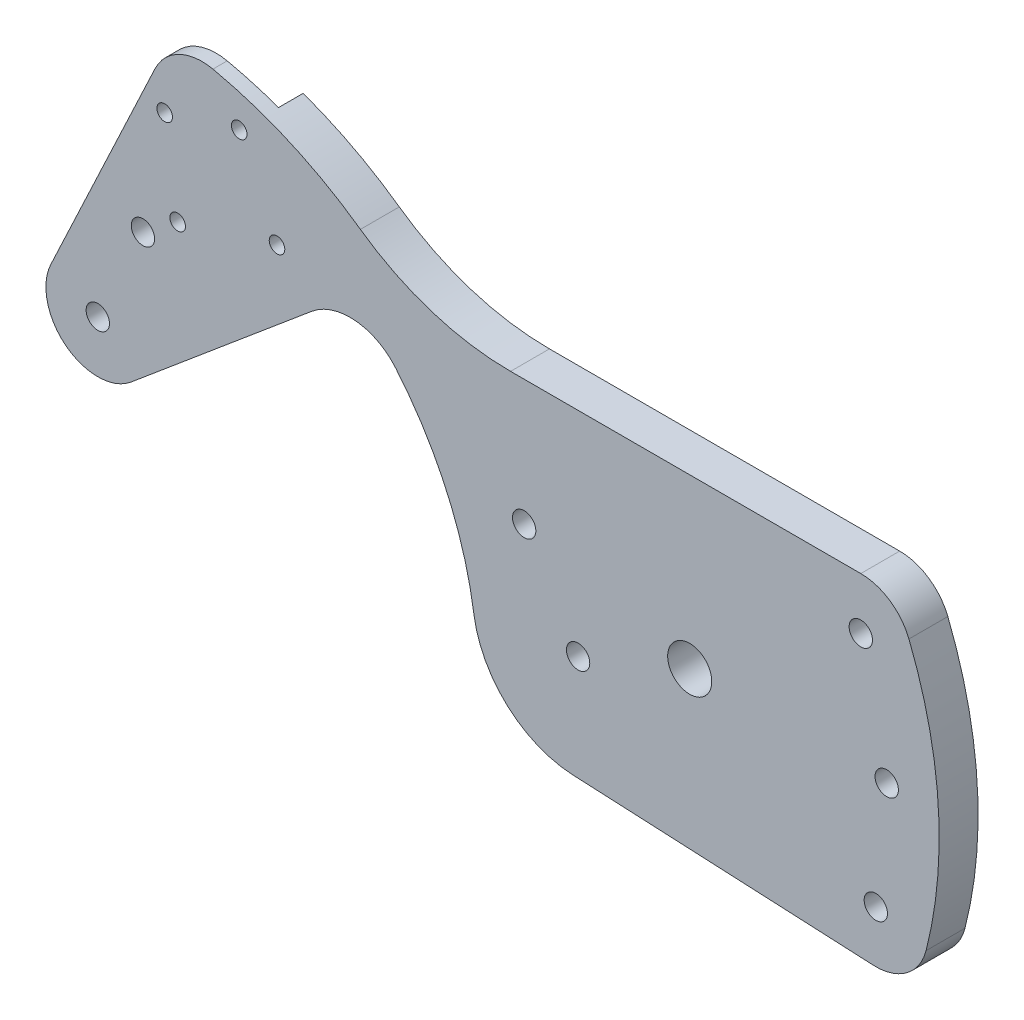
ISO-10303-21;
HEADER;
FILE_DESCRIPTION(('STEP AP214'),'2;1');
FILE_NAME('part.step','',(''),(''),'','','');
FILE_SCHEMA(('AUTOMOTIVE_DESIGN { 1 0 10303 214 1 1 1 1 }'));
ENDSEC;
DATA;
#1=APPLICATION_CONTEXT('core data for automotive mechanical design processes');
#2=APPLICATION_PROTOCOL_DEFINITION('international standard','automotive_design',2000,#1);
#3=PRODUCT_CONTEXT('',#1,'mechanical');
#4=PRODUCT('Part','Part','',(#3));
#5=PRODUCT_RELATED_PRODUCT_CATEGORY('part','',(#4));
#6=PRODUCT_DEFINITION_FORMATION('','',#4);
#7=PRODUCT_DEFINITION_CONTEXT('part definition',#1,'design');
#8=PRODUCT_DEFINITION('design','',#6,#7);
#9=PRODUCT_DEFINITION_SHAPE('','',#8);
#10=(LENGTH_UNIT() NAMED_UNIT(*) SI_UNIT(.MILLI.,.METRE.));
#11=(NAMED_UNIT(*) PLANE_ANGLE_UNIT() SI_UNIT($,.RADIAN.));
#12=(NAMED_UNIT(*) SI_UNIT($,.STERADIAN.) SOLID_ANGLE_UNIT());
#13=UNCERTAINTY_MEASURE_WITH_UNIT(LENGTH_MEASURE(1.E-05),#10,'distance_accuracy_value','');
#14=(GEOMETRIC_REPRESENTATION_CONTEXT(3) GLOBAL_UNCERTAINTY_ASSIGNED_CONTEXT((#13)) GLOBAL_UNIT_ASSIGNED_CONTEXT((#10,
#11,#12)) REPRESENTATION_CONTEXT('',''));
#15=CARTESIAN_POINT('',(0.,0.,0.));
#16=DIRECTION('',(0.,0.,1.));
#17=DIRECTION('',(1.,0.,0.));
#18=AXIS2_PLACEMENT_3D('',#15,#16,#17);
#19=CARTESIAN_POINT('',(-74.1892847970259,-68.5571228840362,7.5));
#20=DIRECTION('',(-0.95769511445002,-0.287784759427187,0.));
#21=DIRECTION('',(0.287784759427187,-0.95769511445002,0.));
#22=AXIS2_PLACEMENT_3D('',#19,#20,#21);
#23=PLANE('',#22);
#24=DIRECTION('',(-0.287784759427187,0.957695114450019,0.));
#25=VECTOR('',#24,1.);
#26=CARTESIAN_POINT('',(-95.9576660688243,3.88407391520334,2.75));
#27=LINE('',#26,#25);
#28=CARTESIAN_POINT('',(-95.9576660688243,3.88407391520334,2.75));
#29=VERTEX_POINT('',#28);
#30=CARTESIAN_POINT('',(-106.945535827358,40.4496974975837,2.75));
#31=VERTEX_POINT('',#30);
#32=EDGE_CURVE('E174',#29,#31,#27,.T.);
#33=ORIENTED_EDGE('',*,*,#32,.T.);
#34=DIRECTION('',(0.,0.,-1.));
#35=VECTOR('',#34,1.);
#36=CARTESIAN_POINT('',(-106.945535827358,40.4496974975837,0.75));
#37=LINE('',#36,#35);
#38=CARTESIAN_POINT('',(-106.945535827358,40.4496974975837,7.5));
#39=VERTEX_POINT('',#38);
#40=EDGE_CURVE('E364',#39,#31,#37,.T.);
#41=ORIENTED_EDGE('',*,*,#40,.F.);
#42=DIRECTION('',(-0.287784759427187,0.95769511445002,0.));
#43=VECTOR('',#42,1.);
#44=CARTESIAN_POINT('',(-74.1892847970259,-68.5571228840362,7.5));
#45=LINE('',#44,#43);
#46=CARTESIAN_POINT('',(-95.9576660688243,3.88407391520334,7.5));
#47=VERTEX_POINT('',#46);
#48=EDGE_CURVE('E11',#47,#39,#45,.T.);
#49=ORIENTED_EDGE('',*,*,#48,.F.);
#50=DIRECTION('',(0.,0.,-1.));
#51=VECTOR('',#50,1.);
#52=CARTESIAN_POINT('',(-95.9576660688243,3.88407391520334,0.75));
#53=LINE('',#52,#51);
#54=EDGE_CURVE('E168',#47,#29,#53,.T.);
#55=ORIENTED_EDGE('',*,*,#54,.T.);
#56=EDGE_LOOP('',(#33,#41,#49,#55));
#57=FACE_BOUND('',#56,.T.);
#58=ADVANCED_FACE('F38',(#57),#23,.F.);
#59=CARTESIAN_POINT('',(-48.3315167068753,-60.7869343795021,7.5));
#60=DIRECTION('',(0.95769511445002,0.287784759427187,0.));
#61=DIRECTION('',(-0.287784759427187,0.95769511445002,0.));
#62=AXIS2_PLACEMENT_3D('',#59,#60,#61);
#63=PLANE('',#62);
#64=DIRECTION('',(0.287784759427188,-0.95769511445002,0.));
#65=VECTOR('',#64,1.);
#66=CARTESIAN_POINT('',(-82.0220970357489,51.329163249051,2.75));
#67=LINE('',#66,#65);
#68=CARTESIAN_POINT('',(-82.0220970357489,51.329163249051,2.75));
#69=VERTEX_POINT('',#68);
#70=CARTESIAN_POINT('',(-73.4421904308482,22.7768012188099,2.75));
#71=VERTEX_POINT('',#70);
#72=EDGE_CURVE('E197',#69,#71,#67,.T.);
#73=ORIENTED_EDGE('',*,*,#72,.T.);
#74=DIRECTION('',(0.,0.,1.));
#75=VECTOR('',#74,1.);
#76=CARTESIAN_POINT('',(-73.4421904308482,22.7768012188099,0.75));
#77=LINE('',#76,#75);
#78=CARTESIAN_POINT('',(-73.4421904308482,22.7768012188099,7.5));
#79=VERTEX_POINT('',#78);
#80=EDGE_CURVE('E180',#71,#79,#77,.T.);
#81=ORIENTED_EDGE('',*,*,#80,.T.);
#82=DIRECTION('',(-0.287784759427187,0.95769511445002,0.));
#83=VECTOR('',#82,1.);
#84=CARTESIAN_POINT('',(-48.3315167068753,-60.7869343795021,7.5));
#85=LINE('',#84,#83);
#86=CARTESIAN_POINT('',(-82.0220970357489,51.3291632490509,7.5));
#87=VERTEX_POINT('',#86);
#88=EDGE_CURVE('E47',#79,#87,#85,.T.);
#89=ORIENTED_EDGE('',*,*,#88,.T.);
#90=DIRECTION('',(0.,0.,1.));
#91=VECTOR('',#90,1.);
#92=CARTESIAN_POINT('',(-82.0220970357489,51.3291632490509,0.75));
#93=LINE('',#92,#91);
#94=EDGE_CURVE('E181',#87,#69,#93,.F.);
#95=ORIENTED_EDGE('',*,*,#94,.T.);
#96=EDGE_LOOP('',(#73,#81,#89,#95));
#97=FACE_BOUND('',#96,.T.);
#98=ADVANCED_FACE('F40',(#97),#63,.F.);
#99=CARTESIAN_POINT('',(-41.5599291638824,49.5291948890183,0.75));
#100=DIRECTION('',(-0.642787609686535,0.766044443118982,0.));
#101=DIRECTION('',(-0.766044443118982,-0.642787609686535,0.));
#102=AXIS2_PLACEMENT_3D('',#99,#100,#101);
#103=PLANE('',#102);
#104=DIRECTION('',(0.766044443118982,0.642787609686534,0.));
#105=VECTOR('',#104,1.);
#106=CARTESIAN_POINT('',(-107.689906175498,-5.96044443118984,2.75));
#107=LINE('',#106,#105);
#108=CARTESIAN_POINT('',(-107.689906175498,-5.96044443118984,2.75));
#109=VERTEX_POINT('',#108);
#110=EDGE_CURVE('E165',#109,#29,#107,.T.);
#111=ORIENTED_EDGE('',*,*,#110,.T.);
#112=ORIENTED_EDGE('',*,*,#54,.F.);
#113=DIRECTION('',(0.766044443118982,0.642787609686534,0.));
#114=VECTOR('',#113,1.);
#115=CARTESIAN_POINT('',(-41.5599291638823,49.5291948890183,7.5));
#116=LINE('',#115,#114);
#117=EDGE_CURVE('E259',#47,#79,#116,.T.);
#118=ORIENTED_EDGE('',*,*,#117,.T.);
#119=ORIENTED_EDGE('',*,*,#80,.F.);
#120=DIRECTION('',(0.766044443118984,0.642787609686532,0.));
#121=VECTOR('',#120,1.);
#122=CARTESIAN_POINT('',(-73.4421904308482,22.7768012188099,2.75));
#123=LINE('',#122,#121);
#124=CARTESIAN_POINT('',(-72.8648183450266,23.2612739230748,2.75));
#125=VERTEX_POINT('',#124);
#126=EDGE_CURVE('E200',#71,#125,#123,.T.);
#127=ORIENTED_EDGE('',*,*,#126,.T.);
#128=DIRECTION('',(0.,0.,1.));
#129=VECTOR('',#128,1.);
#130=CARTESIAN_POINT('',(-72.8648183450266,23.2612739230748,0.75));
#131=LINE('',#130,#129);
#132=CARTESIAN_POINT('',(-72.8648183450266,23.2612739230748,10.25));
#133=VERTEX_POINT('',#132);
#134=EDGE_CURVE('E345',#125,#133,#131,.T.);
#135=ORIENTED_EDGE('',*,*,#134,.T.);
#136=DIRECTION('',(0.766044443118982,0.642787609686535,0.));
#137=VECTOR('',#136,1.);
#138=CARTESIAN_POINT('',(-41.5599291638824,49.5291948890183,10.25));
#139=LINE('',#138,#137);
#140=CARTESIAN_POINT('',(-107.689906175498,-5.96044443118984,10.25));
#141=VERTEX_POINT('',#140);
#142=EDGE_CURVE('E274',#141,#133,#139,.T.);
#143=ORIENTED_EDGE('',*,*,#142,.F.);
#144=DIRECTION('',(0.,0.,1.));
#145=VECTOR('',#144,1.);
#146=CARTESIAN_POINT('',(-107.689906175498,-5.96044443118984,0.75));
#147=LINE('',#146,#145);
#148=EDGE_CURVE('E172',#109,#141,#147,.T.);
#149=ORIENTED_EDGE('',*,*,#148,.F.);
#150=EDGE_LOOP('',(#111,#112,#118,#119,#127,#135,#143,#149));
#151=FACE_BOUND('',#150,.T.);
#152=ADVANCED_FACE('F167',(#151),#103,.F.);
#153=CARTESIAN_POINT('',(-34.5381520802066,82.4,0.75));
#154=DIRECTION('',(0.,0.,1.));
#155=DIRECTION('',(-1.,0.,0.));
#156=AXIS2_PLACEMENT_3D('',#153,#154,#155);
#157=CYLINDRICAL_SURFACE('',#156,50.);
#158=DIRECTION('',(0.,0.,1.));
#159=VECTOR('',#158,1.);
#160=CARTESIAN_POINT('',(-63.4870210289497,41.6328197370912,0.75));
#161=LINE('',#160,#159);
#162=CARTESIAN_POINT('',(-63.4870210289497,41.6328197370912,2.75));
#163=VERTEX_POINT('',#162);
#164=CARTESIAN_POINT('',(-63.4870210289497,41.6328197370912,10.25));
#165=VERTEX_POINT('',#164);
#166=EDGE_CURVE('E358',#163,#165,#161,.T.);
#167=ORIENTED_EDGE('',*,*,#166,.T.);
#168=CARTESIAN_POINT('',(-34.5381520802066,82.4,10.25));
#169=DIRECTION('',(0.,0.,1.));
#170=DIRECTION('',(1.,0.,0.));
#171=AXIS2_PLACEMENT_3D('',#168,#169,#170);
#172=CIRCLE('',#171,50.);
#173=CARTESIAN_POINT('',(-34.5381520802066,32.4,10.25));
#174=VERTEX_POINT('',#173);
#175=EDGE_CURVE('E261',#165,#174,#172,.T.);
#176=ORIENTED_EDGE('',*,*,#175,.T.);
#177=DIRECTION('',(0.,0.,1.));
#178=VECTOR('',#177,1.);
#179=CARTESIAN_POINT('',(-34.5381520802066,32.4,0.75));
#180=LINE('',#179,#178);
#181=CARTESIAN_POINT('',(-34.5381520802066,32.4,2.75));
#182=VERTEX_POINT('',#181);
#183=EDGE_CURVE('E321',#182,#174,#180,.T.);
#184=ORIENTED_EDGE('',*,*,#183,.F.);
#185=CARTESIAN_POINT('',(-34.5381520802066,82.4,2.75));
#186=DIRECTION('',(0.,0.,-1.));
#187=DIRECTION('',(1.,0.,0.));
#188=AXIS2_PLACEMENT_3D('',#185,#186,#187);
#189=CIRCLE('',#188,50.);
#190=EDGE_CURVE('E175',#182,#163,#189,.T.);
#191=ORIENTED_EDGE('',*,*,#190,.T.);
#192=EDGE_LOOP('',(#167,#176,#184,#191));
#193=FACE_BOUND('',#192,.T.);
#194=ADVANCED_FACE('F419',(#193),#157,.F.);
#195=CARTESIAN_POINT('',(-108.317782272363,-21.5,0.75));
#196=DIRECTION('',(0.,0.,1.));
#197=DIRECTION('',(-1.,0.,0.));
#198=AXIS2_PLACEMENT_3D('',#195,#196,#197);
#199=CYLINDRICAL_SURFACE('',#198,77.4309374967139);
#200=CARTESIAN_POINT('',(-108.317782272363,-21.5,2.75));
#201=DIRECTION('',(0.,0.,1.));
#202=DIRECTION('',(1.,0.,0.));
#203=AXIS2_PLACEMENT_3D('',#200,#201,#202);
#204=CIRCLE('',#203,77.430937496714);
#205=EDGE_CURVE('E194',#163,#69,#204,.T.);
#206=ORIENTED_EDGE('',*,*,#205,.T.);
#207=ORIENTED_EDGE('',*,*,#94,.F.);
#208=CARTESIAN_POINT('',(-108.317782272363,-21.5,7.5));
#209=DIRECTION('',(0.,0.,-1.));
#210=DIRECTION('',(-1.,0.,0.));
#211=AXIS2_PLACEMENT_3D('',#208,#209,#210);
#212=CIRCLE('',#211,77.4309374967139);
#213=CARTESIAN_POINT('',(-91.9187421242096,54.174444588905,7.5));
#214=VERTEX_POINT('',#213);
#215=EDGE_CURVE('E360',#214,#87,#212,.T.);
#216=ORIENTED_EDGE('',*,*,#215,.F.);
#217=DIRECTION('',(0.,0.,1.));
#218=VECTOR('',#217,1.);
#219=CARTESIAN_POINT('',(-91.9187421242096,54.174444588905,0.75));
#220=LINE('',#219,#218);
#221=CARTESIAN_POINT('',(-91.9187421242096,54.174444588905,10.25));
#222=VERTEX_POINT('',#221);
#223=EDGE_CURVE('E355',#214,#222,#220,.T.);
#224=ORIENTED_EDGE('',*,*,#223,.T.);
#225=CARTESIAN_POINT('',(-108.317782272363,-21.5,10.25));
#226=DIRECTION('',(0.,0.,1.));
#227=DIRECTION('',(1.,0.,0.));
#228=AXIS2_PLACEMENT_3D('',#225,#226,#227);
#229=CIRCLE('',#228,77.4309374967139);
#230=EDGE_CURVE('E264',#165,#222,#229,.T.);
#231=ORIENTED_EDGE('',*,*,#230,.F.);
#232=ORIENTED_EDGE('',*,*,#166,.F.);
#233=EDGE_LOOP('',(#206,#207,#216,#224,#231,#232));
#234=FACE_BOUND('',#233,.T.);
#235=ADVANCED_FACE('F395',(#234),#199,.T.);
#236=CARTESIAN_POINT('',(-103.154731418742,48.5106034239492,0.75));
#237=DIRECTION('',(-0.904929527308425,0.425561453382882,0.));
#238=DIRECTION('',(-0.425561453382882,-0.904929527308425,0.));
#239=AXIS2_PLACEMENT_3D('',#236,#237,#238);
#240=PLANE('',#239);
#241=DIRECTION('',(0.,0.,1.));
#242=VECTOR('',#241,1.);
#243=CARTESIAN_POINT('',(-123.167077545448,5.9556145338288,0.75));
#244=LINE('',#243,#242);
#245=CARTESIAN_POINT('',(-123.167077545448,5.9556145338288,2.75));
#246=VERTEX_POINT('',#245);
#247=CARTESIAN_POINT('',(-123.167077545448,5.9556145338288,10.25));
#248=VERTEX_POINT('',#247);
#249=EDGE_CURVE('E349',#246,#248,#244,.T.);
#250=ORIENTED_EDGE('',*,*,#249,.T.);
#251=DIRECTION('',(0.425561453382882,0.904929527308425,0.));
#252=VECTOR('',#251,1.);
#253=CARTESIAN_POINT('',(-103.154731418742,48.5106034239492,10.25));
#254=LINE('',#253,#252);
#255=CARTESIAN_POINT('',(-103.085929893281,48.6569055183213,10.25));
#256=VERTEX_POINT('',#255);
#257=EDGE_CURVE('E269',#248,#256,#254,.T.);
#258=ORIENTED_EDGE('',*,*,#257,.T.);
#259=DIRECTION('',(0.,0.,1.));
#260=VECTOR('',#259,1.);
#261=CARTESIAN_POINT('',(-103.085929893281,48.6569055183213,0.75));
#262=LINE('',#261,#260);
#263=CARTESIAN_POINT('',(-103.085929893281,48.6569055183213,7.5));
#264=VERTEX_POINT('',#263);
#265=EDGE_CURVE('E352',#264,#256,#262,.T.);
#266=ORIENTED_EDGE('',*,*,#265,.F.);
#267=DIRECTION('',(-0.425561453382882,-0.904929527308425,0.));
#268=VECTOR('',#267,1.);
#269=CARTESIAN_POINT('',(-103.154731418742,48.5106034239492,7.5));
#270=LINE('',#269,#268);
#271=EDGE_CURVE('E366',#264,#39,#270,.T.);
#272=ORIENTED_EDGE('',*,*,#271,.T.);
#273=ORIENTED_EDGE('',*,*,#40,.T.);
#274=DIRECTION('',(-0.425561453382882,-0.904929527308425,0.));
#275=VECTOR('',#274,1.);
#276=CARTESIAN_POINT('',(-106.945535827358,40.4496974975837,2.75));
#277=LINE('',#276,#275);
#278=EDGE_CURVE('E184',#31,#246,#277,.T.);
#279=ORIENTED_EDGE('',*,*,#278,.T.);
#280=EDGE_LOOP('',(#250,#258,#266,#272,#273,#279));
#281=FACE_BOUND('',#280,.T.);
#282=ADVANCED_FACE('F413',(#281),#240,.T.);
#283=CARTESIAN_POINT('',(-114.117782272363,1.69999999999999,0.75));
#284=DIRECTION('',(0.,0.,1.));
#285=DIRECTION('',(-1.,0.,0.));
#286=AXIS2_PLACEMENT_3D('',#283,#284,#285);
#287=CYLINDRICAL_SURFACE('',#286,9.99999999999999);
#288=CARTESIAN_POINT('',(-114.117782272363,1.69999999999999,2.75));
#289=DIRECTION('',(0.,0.,1.));
#290=DIRECTION('',(1.,0.,0.));
#291=AXIS2_PLACEMENT_3D('',#288,#289,#290);
#292=CIRCLE('',#291,10.);
#293=EDGE_CURVE('E55',#246,#109,#292,.T.);
#294=ORIENTED_EDGE('',*,*,#293,.T.);
#295=ORIENTED_EDGE('',*,*,#148,.T.);
#296=CARTESIAN_POINT('',(-114.117782272363,1.69999999999999,10.25));
#297=DIRECTION('',(0.,0.,1.));
#298=DIRECTION('',(1.,0.,0.));
#299=AXIS2_PLACEMENT_3D('',#296,#297,#298);
#300=CIRCLE('',#299,9.99999999999999);
#301=EDGE_CURVE('E272',#248,#141,#300,.T.);
#302=ORIENTED_EDGE('',*,*,#301,.F.);
#303=ORIENTED_EDGE('',*,*,#249,.F.);
#304=EDGE_LOOP('',(#294,#295,#302,#303));
#305=FACE_BOUND('',#304,.T.);
#306=ADVANCED_FACE('F411',(#305),#287,.T.);
#307=CARTESIAN_POINT('',(-65.4725042221845,14.4514570095927,0.75));
#308=DIRECTION('',(0.,0.,1.));
#309=DIRECTION('',(-1.,0.,0.));
#310=AXIS2_PLACEMENT_3D('',#307,#308,#309);
#311=CYLINDRICAL_SURFACE('',#310,11.5003992165423);
#312=DIRECTION('',(0.,0.,1.));
#313=VECTOR('',#312,1.);
#314=CARTESIAN_POINT('',(-56.6626873087024,21.8437711324349,0.75));
#315=LINE('',#314,#313);
#316=CARTESIAN_POINT('',(-56.6626873087024,21.8437711324349,2.75));
#317=VERTEX_POINT('',#316);
#318=CARTESIAN_POINT('',(-56.6626873087024,21.8437711324349,10.25));
#319=VERTEX_POINT('',#318);
#320=EDGE_CURVE('E342',#317,#319,#315,.T.);
#321=ORIENTED_EDGE('',*,*,#320,.T.);
#322=CARTESIAN_POINT('',(-65.4725042221845,14.4514570095927,10.25));
#323=DIRECTION('',(0.,0.,1.));
#324=DIRECTION('',(1.,0.,0.));
#325=AXIS2_PLACEMENT_3D('',#322,#323,#324);
#326=CIRCLE('',#325,11.5003992165423);
#327=EDGE_CURVE('E277',#319,#133,#326,.T.);
#328=ORIENTED_EDGE('',*,*,#327,.T.);
#329=ORIENTED_EDGE('',*,*,#134,.F.);
#330=CARTESIAN_POINT('',(-65.4725042221845,14.4514570095927,2.75));
#331=DIRECTION('',(0.,0.,-1.));
#332=DIRECTION('',(1.,0.,0.));
#333=AXIS2_PLACEMENT_3D('',#330,#331,#332);
#334=CIRCLE('',#333,11.5003992165423);
#335=EDGE_CURVE('E203',#125,#317,#334,.T.);
#336=ORIENTED_EDGE('',*,*,#335,.T.);
#337=EDGE_LOOP('',(#321,#328,#329,#336));
#338=FACE_BOUND('',#337,.T.);
#339=ADVANCED_FACE('F401',(#338),#311,.F.);
#340=CARTESIAN_POINT('',(-108.317782272363,-21.5,0.75));
#341=DIRECTION('',(0.,0.,1.));
#342=DIRECTION('',(-1.,0.,0.));
#343=AXIS2_PLACEMENT_3D('',#340,#341,#342);
#344=CYLINDRICAL_SURFACE('',#343,67.4309374967139);
#345=DIRECTION('',(0.,0.,1.));
#346=VECTOR('',#345,1.);
#347=CARTESIAN_POINT('',(-41.6082780723541,-11.662653758524,0.75));
#348=LINE('',#347,#346);
#349=CARTESIAN_POINT('',(-41.6082780723541,-11.662653758524,2.75));
#350=VERTEX_POINT('',#349);
#351=CARTESIAN_POINT('',(-41.6082780723541,-11.662653758524,10.25));
#352=VERTEX_POINT('',#351);
#353=EDGE_CURVE('E339',#350,#352,#348,.T.);
#354=ORIENTED_EDGE('',*,*,#353,.T.);
#355=CARTESIAN_POINT('',(-108.317782272363,-21.5,10.25));
#356=DIRECTION('',(0.,0.,1.));
#357=DIRECTION('',(1.,0.,0.));
#358=AXIS2_PLACEMENT_3D('',#355,#356,#357);
#359=CIRCLE('',#358,67.4309374967139);
#360=EDGE_CURVE('E279',#352,#319,#359,.T.);
#361=ORIENTED_EDGE('',*,*,#360,.T.);
#362=ORIENTED_EDGE('',*,*,#320,.F.);
#363=CARTESIAN_POINT('',(-108.317782272363,-21.5,2.75));
#364=DIRECTION('',(0.,0.,-1.));
#365=DIRECTION('',(1.,0.,0.));
#366=AXIS2_PLACEMENT_3D('',#363,#364,#365);
#367=CIRCLE('',#366,67.4309374967139);
#368=EDGE_CURVE('E206',#317,#350,#367,.T.);
#369=ORIENTED_EDGE('',*,*,#368,.T.);
#370=EDGE_LOOP('',(#354,#361,#362,#369));
#371=FACE_BOUND('',#370,.T.);
#372=ADVANCED_FACE('F438',(#371),#344,.F.);
#373=CARTESIAN_POINT('',(-21.5177822723635,-8.70000000000001,0.75));
#374=DIRECTION('',(0.,0.,1.));
#375=DIRECTION('',(-1.,0.,0.));
#376=AXIS2_PLACEMENT_3D('',#373,#374,#375);
#377=CYLINDRICAL_SURFACE('',#376,20.3077654797946);
#378=CARTESIAN_POINT('',(-21.5177822723635,-8.70000000000001,2.75));
#379=DIRECTION('',(0.,0.,1.));
#380=DIRECTION('',(1.,0.,0.));
#381=AXIS2_PLACEMENT_3D('',#378,#379,#380);
#382=CIRCLE('',#381,20.3077654797946);
#383=CARTESIAN_POINT('',(-22.5002308320871,-28.9839871230938,2.75));
#384=VERTEX_POINT('',#383);
#385=EDGE_CURVE('E209',#350,#384,#382,.T.);
#386=ORIENTED_EDGE('',*,*,#385,.T.);
#387=DIRECTION('',(0.,0.,1.));
#388=VECTOR('',#387,1.);
#389=CARTESIAN_POINT('',(-22.5002308320871,-28.9839871230938,0.75));
#390=LINE('',#389,#388);
#391=CARTESIAN_POINT('',(-22.5002308320871,-28.9839871230938,10.25));
#392=VERTEX_POINT('',#391);
#393=EDGE_CURVE('E336',#384,#392,#390,.T.);
#394=ORIENTED_EDGE('',*,*,#393,.T.);
#395=CARTESIAN_POINT('',(-21.5177822723635,-8.70000000000001,10.25));
#396=DIRECTION('',(0.,0.,1.));
#397=DIRECTION('',(1.,0.,0.));
#398=AXIS2_PLACEMENT_3D('',#395,#396,#397);
#399=CIRCLE('',#398,20.3077654797946);
#400=EDGE_CURVE('E281',#352,#392,#399,.T.);
#401=ORIENTED_EDGE('',*,*,#400,.F.);
#402=ORIENTED_EDGE('',*,*,#353,.F.);
#403=EDGE_LOOP('',(#386,#394,#401,#402));
#404=FACE_BOUND('',#403,.T.);
#405=ADVANCED_FACE('F439',(#404),#377,.T.);
#406=CARTESIAN_POINT('',(-1.45320494845944,-30.0033932260633,0.75));
#407=DIRECTION('',(-0.0483779744601208,-0.998829100290503,0.));
#408=DIRECTION('',(0.998829100290503,-0.0483779744601208,0.));
#409=AXIS2_PLACEMENT_3D('',#406,#407,#408);
#410=PLANE('',#409);
#411=DIRECTION('',(0.,0.,1.));
#412=VECTOR('',#411,1.);
#413=CARTESIAN_POINT('',(35.3984379830354,-31.788291002905,0.75));
#414=LINE('',#413,#412);
#415=CARTESIAN_POINT('',(35.3984379830354,-31.788291002905,2.75));
#416=VERTEX_POINT('',#415);
#417=CARTESIAN_POINT('',(35.3984379830354,-31.788291002905,10.25));
#418=VERTEX_POINT('',#417);
#419=EDGE_CURVE('E333',#416,#418,#414,.T.);
#420=ORIENTED_EDGE('',*,*,#419,.T.);
#421=DIRECTION('',(-0.998829100290503,0.0483779744601208,0.));
#422=VECTOR('',#421,1.);
#423=CARTESIAN_POINT('',(-1.45320494845944,-30.0033932260633,10.25));
#424=LINE('',#423,#422);
#425=EDGE_CURVE('E284',#418,#392,#424,.T.);
#426=ORIENTED_EDGE('',*,*,#425,.T.);
#427=ORIENTED_EDGE('',*,*,#393,.F.);
#428=DIRECTION('',(0.998829100290503,-0.0483779744601209,0.));
#429=VECTOR('',#428,1.);
#430=CARTESIAN_POINT('',(-22.5002308320871,-28.9839871230938,2.75));
#431=LINE('',#430,#429);
#432=EDGE_CURVE('E212',#384,#416,#431,.T.);
#433=ORIENTED_EDGE('',*,*,#432,.T.);
#434=EDGE_LOOP('',(#420,#426,#427,#433));
#435=FACE_BOUND('',#434,.T.);
#436=ADVANCED_FACE('F433',(#435),#410,.T.);
#437=CARTESIAN_POINT('',(35.8822177276366,-21.8,0.75));
#438=DIRECTION('',(0.,0.,1.));
#439=DIRECTION('',(-1.,0.,0.));
#440=AXIS2_PLACEMENT_3D('',#437,#438,#439);
#441=CYLINDRICAL_SURFACE('',#440,9.99999999999999);
#442=CARTESIAN_POINT('',(35.8822177276366,-21.8,2.75));
#443=DIRECTION('',(0.,0.,1.));
#444=DIRECTION('',(1.,0.,0.));
#445=AXIS2_PLACEMENT_3D('',#442,#443,#444);
#446=CIRCLE('',#445,9.99999999999999);
#447=CARTESIAN_POINT('',(45.5722671365024,-24.2704134175759,2.75));
#448=VERTEX_POINT('',#447);
#449=EDGE_CURVE('E215',#416,#448,#446,.T.);
#450=ORIENTED_EDGE('',*,*,#449,.T.);
#451=DIRECTION('',(0.,0.,1.));
#452=VECTOR('',#451,1.);
#453=CARTESIAN_POINT('',(45.5722671365024,-24.2704134175759,0.75));
#454=LINE('',#453,#452);
#455=CARTESIAN_POINT('',(45.5722671365024,-24.2704134175759,10.25));
#456=VERTEX_POINT('',#455);
#457=EDGE_CURVE('E330',#448,#456,#454,.T.);
#458=ORIENTED_EDGE('',*,*,#457,.T.);
#459=CARTESIAN_POINT('',(35.8822177276366,-21.8,10.25));
#460=DIRECTION('',(0.,0.,1.));
#461=DIRECTION('',(1.,0.,0.));
#462=AXIS2_PLACEMENT_3D('',#459,#460,#461);
#463=CIRCLE('',#462,9.99999999999999);
#464=EDGE_CURVE('E286',#418,#456,#463,.T.);
#465=ORIENTED_EDGE('',*,*,#464,.F.);
#466=ORIENTED_EDGE('',*,*,#419,.F.);
#467=EDGE_LOOP('',(#450,#458,#465,#466));
#468=FACE_BOUND('',#467,.T.);
#469=ADVANCED_FACE('F430',(#468),#441,.T.);
#470=CARTESIAN_POINT('',(-33.3576699128129,-4.14775280898879,0.75));
#471=DIRECTION('',(0.,0.,1.));
#472=DIRECTION('',(-1.,0.,0.));
#473=AXIS2_PLACEMENT_3D('',#470,#471,#472);
#474=CYLINDRICAL_SURFACE('',#473,81.4546280611314);
#475=CARTESIAN_POINT('',(-33.3576699128129,-4.14775280898879,2.75));
#476=DIRECTION('',(0.,0.,1.));
#477=DIRECTION('',(1.,0.,0.));
#478=AXIS2_PLACEMENT_3D('',#475,#476,#477);
#479=CIRCLE('',#478,81.4546280611314);
#480=CARTESIAN_POINT('',(42.2664151883936,26.1153300673927,2.75));
#481=VERTEX_POINT('',#480);
#482=EDGE_CURVE('E218',#448,#481,#479,.T.);
#483=ORIENTED_EDGE('',*,*,#482,.T.);
#484=DIRECTION('',(0.,0.,1.));
#485=VECTOR('',#484,1.);
#486=CARTESIAN_POINT('',(42.2664151883936,26.1153300673927,0.75));
#487=LINE('',#486,#485);
#488=CARTESIAN_POINT('',(42.2664151883936,26.1153300673927,10.25));
#489=VERTEX_POINT('',#488);
#490=EDGE_CURVE('E327',#481,#489,#487,.T.);
#491=ORIENTED_EDGE('',*,*,#490,.T.);
#492=CARTESIAN_POINT('',(-33.3576699128129,-4.14775280898879,10.25));
#493=DIRECTION('',(0.,0.,1.));
#494=DIRECTION('',(1.,0.,0.));
#495=AXIS2_PLACEMENT_3D('',#492,#493,#494);
#496=CIRCLE('',#495,81.4546280611314);
#497=EDGE_CURVE('E289',#456,#489,#496,.T.);
#498=ORIENTED_EDGE('',*,*,#497,.F.);
#499=ORIENTED_EDGE('',*,*,#457,.F.);
#500=EDGE_LOOP('',(#483,#491,#498,#499));
#501=FACE_BOUND('',#500,.T.);
#502=ADVANCED_FACE('F427',(#501),#474,.T.);
#503=CARTESIAN_POINT('',(32.9822177276365,22.4,0.75));
#504=DIRECTION('',(0.,0.,1.));
#505=DIRECTION('',(-1.,0.,0.));
#506=AXIS2_PLACEMENT_3D('',#503,#504,#505);
#507=CYLINDRICAL_SURFACE('',#506,9.99999999999999);
#508=CARTESIAN_POINT('',(32.9822177276365,22.4,2.75));
#509=DIRECTION('',(0.,0.,1.));
#510=DIRECTION('',(1.,0.,0.));
#511=AXIS2_PLACEMENT_3D('',#508,#509,#510);
#512=CIRCLE('',#511,9.99999999999999);
#513=CARTESIAN_POINT('',(32.9822177276365,32.4,2.75));
#514=VERTEX_POINT('',#513);
#515=EDGE_CURVE('E221',#481,#514,#512,.T.);
#516=ORIENTED_EDGE('',*,*,#515,.T.);
#517=DIRECTION('',(0.,0.,1.));
#518=VECTOR('',#517,1.);
#519=CARTESIAN_POINT('',(32.9822177276365,32.4,0.75));
#520=LINE('',#519,#518);
#521=CARTESIAN_POINT('',(32.9822177276365,32.4,10.25));
#522=VERTEX_POINT('',#521);
#523=EDGE_CURVE('E324',#514,#522,#520,.T.);
#524=ORIENTED_EDGE('',*,*,#523,.T.);
#525=CARTESIAN_POINT('',(32.9822177276365,22.4,10.25));
#526=DIRECTION('',(0.,0.,1.));
#527=DIRECTION('',(1.,0.,0.));
#528=AXIS2_PLACEMENT_3D('',#525,#526,#527);
#529=CIRCLE('',#528,9.99999999999999);
#530=EDGE_CURVE('E292',#489,#522,#529,.T.);
#531=ORIENTED_EDGE('',*,*,#530,.F.);
#532=ORIENTED_EDGE('',*,*,#490,.F.);
#533=EDGE_LOOP('',(#516,#524,#531,#532));
#534=FACE_BOUND('',#533,.T.);
#535=ADVANCED_FACE('F424',(#534),#507,.T.);
#536=CARTESIAN_POINT('',(-105.417782272363,20.2,0.75));
#537=DIRECTION('',(0.,0.,1.));
#538=DIRECTION('',(-1.,0.,0.));
#539=AXIS2_PLACEMENT_3D('',#536,#537,#538);
#540=CYLINDRICAL_SURFACE('',#539,2.25);
#541=CARTESIAN_POINT('',(-105.417782272363,20.2,10.25));
#542=DIRECTION('',(0.,0.,1.));
#543=DIRECTION('',(1.,0.,0.));
#544=AXIS2_PLACEMENT_3D('',#541,#542,#543);
#545=CIRCLE('',#544,2.25);
#546=CARTESIAN_POINT('',(-103.167782272363,20.2,10.25));
#547=VERTEX_POINT('',#546);
#548=EDGE_CURVE('E315',#547,#547,#545,.T.);
#549=ORIENTED_EDGE('',*,*,#548,.T.);
#550=EDGE_LOOP('',(#549));
#551=FACE_BOUND('',#550,.T.);
#552=CARTESIAN_POINT('',(-105.417782272363,20.2,2.75));
#553=DIRECTION('',(0.,0.,1.));
#554=DIRECTION('',(1.,0.,0.));
#555=AXIS2_PLACEMENT_3D('',#552,#553,#554);
#556=CIRCLE('',#555,2.25);
#557=CARTESIAN_POINT('',(-103.167782272363,20.2,2.75));
#558=VERTEX_POINT('',#557);
#559=EDGE_CURVE('E227',#558,#558,#556,.T.);
#560=ORIENTED_EDGE('',*,*,#559,.F.);
#561=EDGE_LOOP('',(#560));
#562=FACE_BOUND('',#561,.T.);
#563=ADVANCED_FACE('F514',(#551,#562),#540,.F.);
#564=CARTESIAN_POINT('',(-31.9177822723635,8.19999999999999,0.75));
#565=DIRECTION('',(0.,0.,1.));
#566=DIRECTION('',(-1.,0.,0.));
#567=AXIS2_PLACEMENT_3D('',#564,#565,#566);
#568=CYLINDRICAL_SURFACE('',#567,2.25);
#569=CARTESIAN_POINT('',(-31.9177822723635,8.19999999999999,10.25));
#570=DIRECTION('',(0.,0.,1.));
#571=DIRECTION('',(1.,0.,0.));
#572=AXIS2_PLACEMENT_3D('',#569,#570,#571);
#573=CIRCLE('',#572,2.25);
#574=CARTESIAN_POINT('',(-29.6677822723635,8.19999999999999,10.25));
#575=VERTEX_POINT('',#574);
#576=EDGE_CURVE('E309',#575,#575,#573,.T.);
#577=ORIENTED_EDGE('',*,*,#576,.T.);
#578=EDGE_LOOP('',(#577));
#579=FACE_BOUND('',#578,.T.);
#580=CARTESIAN_POINT('',(-31.9177822723635,8.19999999999999,2.75));
#581=DIRECTION('',(0.,0.,1.));
#582=DIRECTION('',(1.,0.,0.));
#583=AXIS2_PLACEMENT_3D('',#580,#581,#582);
#584=CIRCLE('',#583,2.25);
#585=CARTESIAN_POINT('',(-29.6677822723635,8.19999999999999,2.75));
#586=VERTEX_POINT('',#585);
#587=EDGE_CURVE('E242',#586,#586,#584,.T.);
#588=ORIENTED_EDGE('',*,*,#587,.F.);
#589=EDGE_LOOP('',(#588));
#590=FACE_BOUND('',#589,.T.);
#591=ADVANCED_FACE('F523',(#579,#590),#568,.F.);
#592=CARTESIAN_POINT('',(-21.5177822723635,-8.70000000000001,0.75));
#593=DIRECTION('',(0.,0.,1.));
#594=DIRECTION('',(-1.,0.,0.));
#595=AXIS2_PLACEMENT_3D('',#592,#593,#594);
#596=CYLINDRICAL_SURFACE('',#595,2.25);
#597=CARTESIAN_POINT('',(-21.5177822723635,-8.70000000000001,10.25));
#598=DIRECTION('',(0.,0.,1.));
#599=DIRECTION('',(1.,0.,0.));
#600=AXIS2_PLACEMENT_3D('',#597,#598,#599);
#601=CIRCLE('',#600,2.25);
#602=CARTESIAN_POINT('',(-19.2677822723635,-8.70000000000001,10.25));
#603=VERTEX_POINT('',#602);
#604=EDGE_CURVE('E306',#603,#603,#601,.T.);
#605=ORIENTED_EDGE('',*,*,#604,.T.);
#606=EDGE_LOOP('',(#605));
#607=FACE_BOUND('',#606,.T.);
#608=CARTESIAN_POINT('',(-21.5177822723635,-8.70000000000001,2.75));
#609=DIRECTION('',(0.,0.,1.));
#610=DIRECTION('',(1.,0.,0.));
#611=AXIS2_PLACEMENT_3D('',#608,#609,#610);
#612=CIRCLE('',#611,2.25);
#613=CARTESIAN_POINT('',(-19.2677822723635,-8.70000000000001,2.75));
#614=VERTEX_POINT('',#613);
#615=EDGE_CURVE('E239',#614,#614,#612,.T.);
#616=ORIENTED_EDGE('',*,*,#615,.F.);
#617=EDGE_LOOP('',(#616));
#618=FACE_BOUND('',#617,.T.);
#619=ADVANCED_FACE('F533',(#607,#618),#596,.F.);
#620=CARTESIAN_POINT('',(32.9822177276365,22.4,0.75));
#621=DIRECTION('',(0.,0.,1.));
#622=DIRECTION('',(-1.,0.,0.));
#623=AXIS2_PLACEMENT_3D('',#620,#621,#622);
#624=CYLINDRICAL_SURFACE('',#623,2.25);
#625=CARTESIAN_POINT('',(32.9822177276365,22.4,10.25));
#626=DIRECTION('',(0.,0.,1.));
#627=DIRECTION('',(1.,0.,0.));
#628=AXIS2_PLACEMENT_3D('',#625,#626,#627);
#629=CIRCLE('',#628,2.25);
#630=CARTESIAN_POINT('',(35.2322177276365,22.4,10.25));
#631=VERTEX_POINT('',#630);
#632=EDGE_CURVE('E303',#631,#631,#629,.T.);
#633=ORIENTED_EDGE('',*,*,#632,.T.);
#634=EDGE_LOOP('',(#633));
#635=FACE_BOUND('',#634,.T.);
#636=CARTESIAN_POINT('',(32.9822177276365,22.4,2.75));
#637=DIRECTION('',(0.,0.,1.));
#638=DIRECTION('',(1.,0.,0.));
#639=AXIS2_PLACEMENT_3D('',#636,#637,#638);
#640=CIRCLE('',#639,2.25);
#641=CARTESIAN_POINT('',(35.2322177276365,22.4,2.75));
#642=VERTEX_POINT('',#641);
#643=EDGE_CURVE('E236',#642,#642,#640,.T.);
#644=ORIENTED_EDGE('',*,*,#643,.F.);
#645=EDGE_LOOP('',(#644));
#646=FACE_BOUND('',#645,.T.);
#647=ADVANCED_FACE('F543',(#635,#646),#624,.F.);
#648=CARTESIAN_POINT('',(37.9822177276365,-0.100000000000011,0.75));
#649=DIRECTION('',(0.,0.,1.));
#650=DIRECTION('',(-1.,0.,0.));
#651=AXIS2_PLACEMENT_3D('',#648,#649,#650);
#652=CYLINDRICAL_SURFACE('',#651,2.25);
#653=CARTESIAN_POINT('',(37.9822177276365,-0.100000000000011,10.25));
#654=DIRECTION('',(0.,0.,1.));
#655=DIRECTION('',(1.,0.,0.));
#656=AXIS2_PLACEMENT_3D('',#653,#654,#655);
#657=CIRCLE('',#656,2.25);
#658=CARTESIAN_POINT('',(40.2322177276366,-0.100000000000011,10.25));
#659=VERTEX_POINT('',#658);
#660=EDGE_CURVE('E300',#659,#659,#657,.T.);
#661=ORIENTED_EDGE('',*,*,#660,.T.);
#662=EDGE_LOOP('',(#661));
#663=FACE_BOUND('',#662,.T.);
#664=CARTESIAN_POINT('',(37.9822177276365,-0.100000000000011,2.75));
#665=DIRECTION('',(0.,0.,1.));
#666=DIRECTION('',(1.,0.,0.));
#667=AXIS2_PLACEMENT_3D('',#664,#665,#666);
#668=CIRCLE('',#667,2.25);
#669=CARTESIAN_POINT('',(40.2322177276366,-0.100000000000011,2.75));
#670=VERTEX_POINT('',#669);
#671=EDGE_CURVE('E233',#670,#670,#668,.T.);
#672=ORIENTED_EDGE('',*,*,#671,.F.);
#673=EDGE_LOOP('',(#672));
#674=FACE_BOUND('',#673,.T.);
#675=ADVANCED_FACE('F553',(#663,#674),#652,.F.);
#676=CARTESIAN_POINT('',(35.8822177276366,-21.8,0.75));
#677=DIRECTION('',(0.,0.,1.));
#678=DIRECTION('',(-1.,0.,0.));
#679=AXIS2_PLACEMENT_3D('',#676,#677,#678);
#680=CYLINDRICAL_SURFACE('',#679,2.25);
#681=CARTESIAN_POINT('',(35.8822177276366,-21.8,10.25));
#682=DIRECTION('',(0.,0.,1.));
#683=DIRECTION('',(1.,0.,0.));
#684=AXIS2_PLACEMENT_3D('',#681,#682,#683);
#685=CIRCLE('',#684,2.25);
#686=CARTESIAN_POINT('',(38.1322177276366,-21.8,10.25));
#687=VERTEX_POINT('',#686);
#688=EDGE_CURVE('E297',#687,#687,#685,.T.);
#689=ORIENTED_EDGE('',*,*,#688,.T.);
#690=EDGE_LOOP('',(#689));
#691=FACE_BOUND('',#690,.T.);
#692=CARTESIAN_POINT('',(35.8822177276366,-21.8,2.75));
#693=DIRECTION('',(0.,0.,1.));
#694=DIRECTION('',(1.,0.,0.));
#695=AXIS2_PLACEMENT_3D('',#692,#693,#694);
#696=CIRCLE('',#695,2.25);
#697=CARTESIAN_POINT('',(38.1322177276366,-21.8,2.75));
#698=VERTEX_POINT('',#697);
#699=EDGE_CURVE('E230',#698,#698,#696,.T.);
#700=ORIENTED_EDGE('',*,*,#699,.F.);
#701=EDGE_LOOP('',(#700));
#702=FACE_BOUND('',#701,.T.);
#703=ADVANCED_FACE('F563',(#691,#702),#680,.F.);
#704=CARTESIAN_POINT('',(0.,32.4,0.75));
#705=DIRECTION('',(0.,1.,0.));
#706=DIRECTION('',(0.,0.,-1.));
#707=AXIS2_PLACEMENT_3D('',#704,#705,#706);
#708=PLANE('',#707);
#709=ORIENTED_EDGE('',*,*,#183,.T.);
#710=DIRECTION('',(1.,0.,0.));
#711=VECTOR('',#710,1.);
#712=CARTESIAN_POINT('',(0.,32.4,10.25));
#713=LINE('',#712,#711);
#714=EDGE_CURVE('E295',#174,#522,#713,.T.);
#715=ORIENTED_EDGE('',*,*,#714,.T.);
#716=ORIENTED_EDGE('',*,*,#523,.F.);
#717=DIRECTION('',(-1.,0.,0.));
#718=VECTOR('',#717,1.);
#719=CARTESIAN_POINT('',(32.9822177276365,32.4,2.75));
#720=LINE('',#719,#718);
#721=EDGE_CURVE('E63',#514,#182,#720,.T.);
#722=ORIENTED_EDGE('',*,*,#721,.T.);
#723=EDGE_LOOP('',(#709,#715,#716,#722));
#724=FACE_BOUND('',#723,.T.);
#725=ADVANCED_FACE('F421',(#724),#708,.T.);
#726=CARTESIAN_POINT('',(-114.117782272363,1.69999999999999,0.75));
#727=DIRECTION('',(0.,0.,1.));
#728=DIRECTION('',(-1.,0.,0.));
#729=AXIS2_PLACEMENT_3D('',#726,#727,#728);
#730=CYLINDRICAL_SURFACE('',#729,2.25);
#731=CARTESIAN_POINT('',(-114.117782272363,1.69999999999999,10.25));
#732=DIRECTION('',(0.,0.,1.));
#733=DIRECTION('',(1.,0.,0.));
#734=AXIS2_PLACEMENT_3D('',#731,#732,#733);
#735=CIRCLE('',#734,2.25);
#736=CARTESIAN_POINT('',(-111.867782272363,1.69999999999999,10.25));
#737=VERTEX_POINT('',#736);
#738=EDGE_CURVE('E318',#737,#737,#735,.T.);
#739=ORIENTED_EDGE('',*,*,#738,.T.);
#740=EDGE_LOOP('',(#739));
#741=FACE_BOUND('',#740,.T.);
#742=CARTESIAN_POINT('',(-114.117782272363,1.69999999999999,2.75));
#743=DIRECTION('',(0.,0.,1.));
#744=DIRECTION('',(1.,0.,0.));
#745=AXIS2_PLACEMENT_3D('',#742,#743,#744);
#746=CIRCLE('',#745,2.25);
#747=CARTESIAN_POINT('',(-111.867782272363,1.69999999999999,2.75));
#748=VERTEX_POINT('',#747);
#749=EDGE_CURVE('E42',#748,#748,#746,.T.);
#750=ORIENTED_EDGE('',*,*,#749,.F.);
#751=EDGE_LOOP('',(#750));
#752=FACE_BOUND('',#751,.T.);
#753=ADVANCED_FACE('F582',(#741,#752),#730,.F.);
#754=CARTESIAN_POINT('',(0.,0.,7.5));
#755=DIRECTION('',(0.,0.,-1.));
#756=DIRECTION('',(1.,0.,0.));
#757=AXIS2_PLACEMENT_3D('',#754,#755,#756);
#758=PLANE('',#757);
#759=ORIENTED_EDGE('',*,*,#117,.F.);
#760=ORIENTED_EDGE('',*,*,#48,.T.);
#761=ORIENTED_EDGE('',*,*,#271,.F.);
#762=CARTESIAN_POINT('',(-94.0366346201967,44.4012909844925,7.5));
#763=DIRECTION('',(0.,0.,1.));
#764=DIRECTION('',(1.,0.,0.));
#765=AXIS2_PLACEMENT_3D('',#762,#763,#764);
#766=CIRCLE('',#765,9.99999999999998);
#767=EDGE_CURVE('E249',#214,#264,#766,.T.);
#768=ORIENTED_EDGE('',*,*,#767,.F.);
#769=ORIENTED_EDGE('',*,*,#215,.T.);
#770=ORIENTED_EDGE('',*,*,#88,.F.);
#771=EDGE_LOOP('',(#759,#760,#761,#768,#769,#770));
#772=FACE_BOUND('',#771,.T.);
#773=CARTESIAN_POINT('',(-98.7212448544347,25.2426264445703,7.5));
#774=DIRECTION('',(0.,0.,-1.));
#775=DIRECTION('',(-1.,0.,0.));
#776=AXIS2_PLACEMENT_3D('',#773,#774,#775);
#777=CIRCLE('',#776,1.5);
#778=CARTESIAN_POINT('',(-100.221244854435,25.2426264445703,7.5));
#779=VERTEX_POINT('',#778);
#780=EDGE_CURVE('E369',#779,#779,#777,.F.);
#781=ORIENTED_EDGE('',*,*,#780,.T.);
#782=EDGE_LOOP('',(#781));
#783=FACE_BOUND('',#782,.T.);
#784=CARTESIAN_POINT('',(-101.219347978572,42.2429052887889,7.5));
#785=DIRECTION('',(0.,0.,-1.));
#786=DIRECTION('',(-1.,0.,0.));
#787=AXIS2_PLACEMENT_3D('',#784,#785,#786);
#788=CIRCLE('',#787,1.5);
#789=CARTESIAN_POINT('',(-102.719347978572,42.2429052887889,7.5));
#790=VERTEX_POINT('',#789);
#791=EDGE_CURVE('E372',#790,#790,#788,.F.);
#792=ORIENTED_EDGE('',*,*,#791,.T.);
#793=EDGE_LOOP('',(#792));
#794=FACE_BOUND('',#793,.T.);
#795=CARTESIAN_POINT('',(-86.8539212618216,46.5596766801966,7.5));
#796=DIRECTION('',(0.,0.,-1.));
#797=DIRECTION('',(-1.,0.,0.));
#798=AXIS2_PLACEMENT_3D('',#795,#796,#797);
#799=CIRCLE('',#798,1.5);
#800=CARTESIAN_POINT('',(-88.3539212618216,46.5596766801966,7.5));
#801=VERTEX_POINT('',#800);
#802=EDGE_CURVE('E375',#801,#801,#799,.F.);
#803=ORIENTED_EDGE('',*,*,#802,.T.);
#804=EDGE_LOOP('',(#803));
#805=FACE_BOUND('',#804,.T.);
#806=CARTESIAN_POINT('',(-79.5673425654343,30.998321633114,7.5));
#807=DIRECTION('',(0.,0.,-1.));
#808=DIRECTION('',(-1.,0.,0.));
#809=AXIS2_PLACEMENT_3D('',#806,#807,#808);
#810=CIRCLE('',#809,1.5);
#811=CARTESIAN_POINT('',(-81.0673425654343,30.998321633114,7.5));
#812=VERTEX_POINT('',#811);
#813=EDGE_CURVE('E368',#812,#812,#810,.F.);
#814=ORIENTED_EDGE('',*,*,#813,.T.);
#815=EDGE_LOOP('',(#814));
#816=FACE_BOUND('',#815,.T.);
#817=ADVANCED_FACE('F388',(#772,#783,#794,#805,#816),#758,.T.);
#818=CARTESIAN_POINT('',(-79.5673425654343,30.998321633114,10.25));
#819=DIRECTION('',(0.,0.,-1.));
#820=DIRECTION('',(1.,0.,0.));
#821=AXIS2_PLACEMENT_3D('',#818,#819,#820);
#822=CYLINDRICAL_SURFACE('',#821,1.5);
#823=ORIENTED_EDGE('',*,*,#813,.F.);
#824=EDGE_LOOP('',(#823));
#825=FACE_BOUND('',#824,.T.);
#826=CARTESIAN_POINT('',(-79.5673425654343,30.998321633114,10.25));
#827=DIRECTION('',(0.,0.,1.));
#828=DIRECTION('',(1.,0.,0.));
#829=AXIS2_PLACEMENT_3D('',#826,#827,#828);
#830=CIRCLE('',#829,1.5);
#831=CARTESIAN_POINT('',(-78.0673425654343,30.998321633114,10.25));
#832=VERTEX_POINT('',#831);
#833=EDGE_CURVE('E245',#832,#832,#830,.T.);
#834=ORIENTED_EDGE('',*,*,#833,.T.);
#835=EDGE_LOOP('',(#834));
#836=FACE_BOUND('',#835,.T.);
#837=ADVANCED_FACE('F600',(#825,#836),#822,.F.);
#838=CARTESIAN_POINT('',(-86.8539212618216,46.5596766801966,10.25));
#839=DIRECTION('',(0.,0.,-1.));
#840=DIRECTION('',(1.,0.,0.));
#841=AXIS2_PLACEMENT_3D('',#838,#839,#840);
#842=CYLINDRICAL_SURFACE('',#841,1.5);
#843=ORIENTED_EDGE('',*,*,#802,.F.);
#844=EDGE_LOOP('',(#843));
#845=FACE_BOUND('',#844,.T.);
#846=CARTESIAN_POINT('',(-86.8539212618216,46.5596766801966,10.25));
#847=DIRECTION('',(0.,0.,1.));
#848=DIRECTION('',(1.,0.,0.));
#849=AXIS2_PLACEMENT_3D('',#846,#847,#848);
#850=CIRCLE('',#849,1.5);
#851=CARTESIAN_POINT('',(-85.3539212618216,46.5596766801966,10.25));
#852=VERTEX_POINT('',#851);
#853=EDGE_CURVE('E253',#852,#852,#850,.T.);
#854=ORIENTED_EDGE('',*,*,#853,.T.);
#855=EDGE_LOOP('',(#854));
#856=FACE_BOUND('',#855,.T.);
#857=ADVANCED_FACE('F615',(#845,#856),#842,.F.);
#858=CARTESIAN_POINT('',(-101.219347978572,42.2429052887889,10.25));
#859=DIRECTION('',(0.,0.,-1.));
#860=DIRECTION('',(1.,0.,0.));
#861=AXIS2_PLACEMENT_3D('',#858,#859,#860);
#862=CYLINDRICAL_SURFACE('',#861,1.5);
#863=ORIENTED_EDGE('',*,*,#791,.F.);
#864=EDGE_LOOP('',(#863));
#865=FACE_BOUND('',#864,.T.);
#866=CARTESIAN_POINT('',(-101.219347978572,42.2429052887889,10.25));
#867=DIRECTION('',(0.,0.,1.));
#868=DIRECTION('',(1.,0.,0.));
#869=AXIS2_PLACEMENT_3D('',#866,#867,#868);
#870=CIRCLE('',#869,1.5);
#871=CARTESIAN_POINT('',(-99.7193479785719,42.2429052887889,10.25));
#872=VERTEX_POINT('',#871);
#873=EDGE_CURVE('E250',#872,#872,#870,.T.);
#874=ORIENTED_EDGE('',*,*,#873,.T.);
#875=EDGE_LOOP('',(#874));
#876=FACE_BOUND('',#875,.T.);
#877=ADVANCED_FACE('F625',(#865,#876),#862,.F.);
#878=CARTESIAN_POINT('',(-98.7212448544347,25.2426264445703,10.25));
#879=DIRECTION('',(0.,0.,-1.));
#880=DIRECTION('',(1.,0.,0.));
#881=AXIS2_PLACEMENT_3D('',#878,#879,#880);
#882=CYLINDRICAL_SURFACE('',#881,1.5);
#883=ORIENTED_EDGE('',*,*,#780,.F.);
#884=EDGE_LOOP('',(#883));
#885=FACE_BOUND('',#884,.T.);
#886=CARTESIAN_POINT('',(-98.7212448544347,25.2426264445703,10.25));
#887=DIRECTION('',(0.,0.,1.));
#888=DIRECTION('',(1.,0.,0.));
#889=AXIS2_PLACEMENT_3D('',#886,#887,#888);
#890=CIRCLE('',#889,1.5);
#891=CARTESIAN_POINT('',(-97.2212448544347,25.2426264445703,10.25));
#892=VERTEX_POINT('',#891);
#893=EDGE_CURVE('E246',#892,#892,#890,.T.);
#894=ORIENTED_EDGE('',*,*,#893,.T.);
#895=EDGE_LOOP('',(#894));
#896=FACE_BOUND('',#895,.T.);
#897=ADVANCED_FACE('F460',(#885,#896),#882,.F.);
#898=CARTESIAN_POINT('',(-94.0366346201967,44.4012909844925,0.75));
#899=DIRECTION('',(0.,0.,1.));
#900=DIRECTION('',(-1.,0.,0.));
#901=AXIS2_PLACEMENT_3D('',#898,#899,#900);
#902=CYLINDRICAL_SURFACE('',#901,9.99999999999999);
#903=ORIENTED_EDGE('',*,*,#265,.T.);
#904=CARTESIAN_POINT('',(-94.0366346201967,44.4012909844925,10.25));
#905=DIRECTION('',(0.,0.,1.));
#906=DIRECTION('',(1.,0.,0.));
#907=AXIS2_PLACEMENT_3D('',#904,#905,#906);
#908=CIRCLE('',#907,9.99999999999999);
#909=EDGE_CURVE('E267',#222,#256,#908,.T.);
#910=ORIENTED_EDGE('',*,*,#909,.F.);
#911=ORIENTED_EDGE('',*,*,#223,.F.);
#912=ORIENTED_EDGE('',*,*,#767,.T.);
#913=EDGE_LOOP('',(#903,#910,#911,#912));
#914=FACE_BOUND('',#913,.T.);
#915=ADVANCED_FACE('F416',(#914),#902,.T.);
#916=CARTESIAN_POINT('',(0.,0.,0.75));
#917=DIRECTION('',(0.,0.,1.));
#918=DIRECTION('',(-1.,0.,0.));
#919=AXIS2_PLACEMENT_3D('',#916,#917,#918);
#920=CYLINDRICAL_SURFACE('',#919,4.25);
#921=CARTESIAN_POINT('',(0.,0.,10.25));
#922=DIRECTION('',(0.,0.,1.));
#923=DIRECTION('',(1.,0.,0.));
#924=AXIS2_PLACEMENT_3D('',#921,#922,#923);
#925=CIRCLE('',#924,4.25);
#926=CARTESIAN_POINT('',(4.25,0.,10.25));
#927=VERTEX_POINT('',#926);
#928=EDGE_CURVE('E312',#927,#927,#925,.T.);
#929=ORIENTED_EDGE('',*,*,#928,.T.);
#930=EDGE_LOOP('',(#929));
#931=FACE_BOUND('',#930,.T.);
#932=CARTESIAN_POINT('',(0.,0.,-2.25));
#933=DIRECTION('',(0.,0.,1.));
#934=DIRECTION('',(1.,0.,0.));
#935=AXIS2_PLACEMENT_3D('',#932,#933,#934);
#936=CIRCLE('',#935,4.25);
#937=CARTESIAN_POINT('',(4.25,0.,-2.25));
#938=VERTEX_POINT('',#937);
#939=EDGE_CURVE('E734',#938,#938,#936,.T.);
#940=ORIENTED_EDGE('',*,*,#939,.F.);
#941=EDGE_LOOP('',(#940));
#942=FACE_BOUND('',#941,.T.);
#943=ADVANCED_FACE('F459',(#931,#942),#920,.F.);
#944=CARTESIAN_POINT('',(0.,0.,10.25));
#945=DIRECTION('',(0.,0.,-1.));
#946=DIRECTION('',(1.,0.,0.));
#947=AXIS2_PLACEMENT_3D('',#944,#945,#946);
#948=PLANE('',#947);
#949=ORIENTED_EDGE('',*,*,#893,.F.);
#950=EDGE_LOOP('',(#949));
#951=FACE_BOUND('',#950,.T.);
#952=ORIENTED_EDGE('',*,*,#873,.F.);
#953=EDGE_LOOP('',(#952));
#954=FACE_BOUND('',#953,.T.);
#955=ORIENTED_EDGE('',*,*,#853,.F.);
#956=EDGE_LOOP('',(#955));
#957=FACE_BOUND('',#956,.T.);
#958=ORIENTED_EDGE('',*,*,#833,.F.);
#959=EDGE_LOOP('',(#958));
#960=FACE_BOUND('',#959,.T.);
#961=ORIENTED_EDGE('',*,*,#175,.F.);
#962=ORIENTED_EDGE('',*,*,#230,.T.);
#963=ORIENTED_EDGE('',*,*,#909,.T.);
#964=ORIENTED_EDGE('',*,*,#257,.F.);
#965=ORIENTED_EDGE('',*,*,#301,.T.);
#966=ORIENTED_EDGE('',*,*,#142,.T.);
#967=ORIENTED_EDGE('',*,*,#327,.F.);
#968=ORIENTED_EDGE('',*,*,#360,.F.);
#969=ORIENTED_EDGE('',*,*,#400,.T.);
#970=ORIENTED_EDGE('',*,*,#425,.F.);
#971=ORIENTED_EDGE('',*,*,#464,.T.);
#972=ORIENTED_EDGE('',*,*,#497,.T.);
#973=ORIENTED_EDGE('',*,*,#530,.T.);
#974=ORIENTED_EDGE('',*,*,#714,.F.);
#975=EDGE_LOOP('',(#961,#962,#963,#964,#965,#966,#967,#968,#969,#970,#971,#972,#973,#974));
#976=FACE_BOUND('',#975,.T.);
#977=ORIENTED_EDGE('',*,*,#688,.F.);
#978=EDGE_LOOP('',(#977));
#979=FACE_BOUND('',#978,.T.);
#980=ORIENTED_EDGE('',*,*,#660,.F.);
#981=EDGE_LOOP('',(#980));
#982=FACE_BOUND('',#981,.T.);
#983=ORIENTED_EDGE('',*,*,#632,.F.);
#984=EDGE_LOOP('',(#983));
#985=FACE_BOUND('',#984,.T.);
#986=ORIENTED_EDGE('',*,*,#604,.F.);
#987=EDGE_LOOP('',(#986));
#988=FACE_BOUND('',#987,.T.);
#989=ORIENTED_EDGE('',*,*,#576,.F.);
#990=EDGE_LOOP('',(#989));
#991=FACE_BOUND('',#990,.T.);
#992=ORIENTED_EDGE('',*,*,#928,.F.);
#993=EDGE_LOOP('',(#992));
#994=FACE_BOUND('',#993,.T.);
#995=ORIENTED_EDGE('',*,*,#548,.F.);
#996=EDGE_LOOP('',(#995));
#997=FACE_BOUND('',#996,.T.);
#998=ORIENTED_EDGE('',*,*,#738,.F.);
#999=EDGE_LOOP('',(#998));
#1000=FACE_BOUND('',#999,.T.);
#1001=ADVANCED_FACE('F405',(#951,#954,#957,#960,#976,#979,#982,#985,#988,#991,#994,#997,#1000),
#948,.F.);
#1002=CARTESIAN_POINT('',(-114.117782272363,1.69999999999999,2.75));
#1003=DIRECTION('',(0.,0.,-1.));
#1004=DIRECTION('',(1.,0.,0.));
#1005=AXIS2_PLACEMENT_3D('',#1002,#1003,#1004);
#1006=PLANE('',#1005);
#1007=ORIENTED_EDGE('',*,*,#559,.T.);
#1008=EDGE_LOOP('',(#1007));
#1009=FACE_BOUND('',#1008,.T.);
#1010=ORIENTED_EDGE('',*,*,#749,.T.);
#1011=EDGE_LOOP('',(#1010));
#1012=FACE_BOUND('',#1011,.T.);
#1013=ORIENTED_EDGE('',*,*,#110,.F.);
#1014=ORIENTED_EDGE('',*,*,#293,.F.);
#1015=ORIENTED_EDGE('',*,*,#278,.F.);
#1016=ORIENTED_EDGE('',*,*,#32,.F.);
#1017=EDGE_LOOP('',(#1013,#1014,#1015,#1016));
#1018=FACE_BOUND('',#1017,.T.);
#1019=ADVANCED_FACE('F183',(#1009,#1012,#1018),#1006,.T.);
#1020=CARTESIAN_POINT('',(-108.317782272363,-21.5,2.75));
#1021=DIRECTION('',(0.,0.,-1.));
#1022=DIRECTION('',(1.,0.,0.));
#1023=AXIS2_PLACEMENT_3D('',#1020,#1021,#1022);
#1024=PLANE('',#1023);
#1025=ORIENTED_EDGE('',*,*,#587,.T.);
#1026=EDGE_LOOP('',(#1025));
#1027=FACE_BOUND('',#1026,.T.);
#1028=ORIENTED_EDGE('',*,*,#615,.T.);
#1029=EDGE_LOOP('',(#1028));
#1030=FACE_BOUND('',#1029,.T.);
#1031=ORIENTED_EDGE('',*,*,#643,.T.);
#1032=EDGE_LOOP('',(#1031));
#1033=FACE_BOUND('',#1032,.T.);
#1034=ORIENTED_EDGE('',*,*,#671,.T.);
#1035=EDGE_LOOP('',(#1034));
#1036=FACE_BOUND('',#1035,.T.);
#1037=ORIENTED_EDGE('',*,*,#699,.T.);
#1038=EDGE_LOOP('',(#1037));
#1039=FACE_BOUND('',#1038,.T.);
#1040=CARTESIAN_POINT('',(0.,0.,2.75));
#1041=DIRECTION('',(0.,0.,1.));
#1042=DIRECTION('',(1.,0.,0.));
#1043=AXIS2_PLACEMENT_3D('',#1040,#1041,#1042);
#1044=CIRCLE('',#1043,15.71001839553);
#1045=CARTESIAN_POINT('',(15.71001839553,0.,2.75));
#1046=VERTEX_POINT('',#1045);
#1047=EDGE_CURVE('E191',#1046,#1046,#1044,.T.);
#1048=ORIENTED_EDGE('',*,*,#1047,.T.);
#1049=EDGE_LOOP('',(#1048));
#1050=FACE_BOUND('',#1049,.T.);
#1051=ORIENTED_EDGE('',*,*,#205,.F.);
#1052=ORIENTED_EDGE('',*,*,#190,.F.);
#1053=ORIENTED_EDGE('',*,*,#721,.F.);
#1054=ORIENTED_EDGE('',*,*,#515,.F.);
#1055=ORIENTED_EDGE('',*,*,#482,.F.);
#1056=ORIENTED_EDGE('',*,*,#449,.F.);
#1057=ORIENTED_EDGE('',*,*,#432,.F.);
#1058=ORIENTED_EDGE('',*,*,#385,.F.);
#1059=ORIENTED_EDGE('',*,*,#368,.F.);
#1060=ORIENTED_EDGE('',*,*,#335,.F.);
#1061=ORIENTED_EDGE('',*,*,#126,.F.);
#1062=ORIENTED_EDGE('',*,*,#72,.F.);
#1063=EDGE_LOOP('',(#1051,#1052,#1053,#1054,#1055,#1056,#1057,#1058,#1059,#1060,#1061,#1062));
#1064=FACE_BOUND('',#1063,.T.);
#1065=ADVANCED_FACE('F397',(#1027,#1030,#1033,#1036,#1039,#1050,#1064),#1024,.T.);
#1066=CARTESIAN_POINT('',(0.,0.,2.75));
#1067=DIRECTION('',(0.,0.,-1.));
#1068=DIRECTION('',(1.,0.,0.));
#1069=AXIS2_PLACEMENT_3D('',#1066,#1067,#1068);
#1070=CYLINDRICAL_SURFACE('',#1069,15.71001839553);
#1071=ORIENTED_EDGE('',*,*,#1047,.F.);
#1072=EDGE_LOOP('',(#1071));
#1073=FACE_BOUND('',#1072,.T.);
#1074=CARTESIAN_POINT('',(0.,0.,-2.25));
#1075=DIRECTION('',(0.,0.,1.));
#1076=DIRECTION('',(1.,0.,0.));
#1077=AXIS2_PLACEMENT_3D('',#1074,#1075,#1076);
#1078=CIRCLE('',#1077,15.71001839553);
#1079=CARTESIAN_POINT('',(15.71001839553,0.,-2.25));
#1080=VERTEX_POINT('',#1079);
#1081=EDGE_CURVE('E195',#1080,#1080,#1078,.T.);
#1082=ORIENTED_EDGE('',*,*,#1081,.T.);
#1083=EDGE_LOOP('',(#1082));
#1084=FACE_BOUND('',#1083,.T.);
#1085=ADVANCED_FACE('F703',(#1073,#1084),#1070,.T.);
#1086=CARTESIAN_POINT('',(0.,0.,-2.25));
#1087=DIRECTION('',(0.,0.,-1.));
#1088=DIRECTION('',(1.,0.,0.));
#1089=AXIS2_PLACEMENT_3D('',#1086,#1087,#1088);
#1090=PLANE('',#1089);
#1091=ORIENTED_EDGE('',*,*,#1081,.F.);
#1092=EDGE_LOOP('',(#1091));
#1093=FACE_BOUND('',#1092,.T.);
#1094=ORIENTED_EDGE('',*,*,#939,.T.);
#1095=EDGE_LOOP('',(#1094));
#1096=FACE_BOUND('',#1095,.T.);
#1097=ADVANCED_FACE('F713',(#1093,#1096),#1090,.T.);
#1098=CLOSED_SHELL('',(#58,#98,#152,#194,#235,#282,#306,#339,#372,#405,#436,#469,#502,#535,#563,
#591,#619,#647,#675,#703,#725,#753,#817,#837,#857,#877,#897,#915,#943,#1001,#1019,#1065,#1085,#1097));
#1099=MANIFOLD_SOLID_BREP('B2',#1098);
#1100=ADVANCED_BREP_SHAPE_REPRESENTATION('',(#18,#1099),#14);
#1101=SHAPE_DEFINITION_REPRESENTATION(#9,#1100);
ENDSEC;
END-ISO-10303-21;
